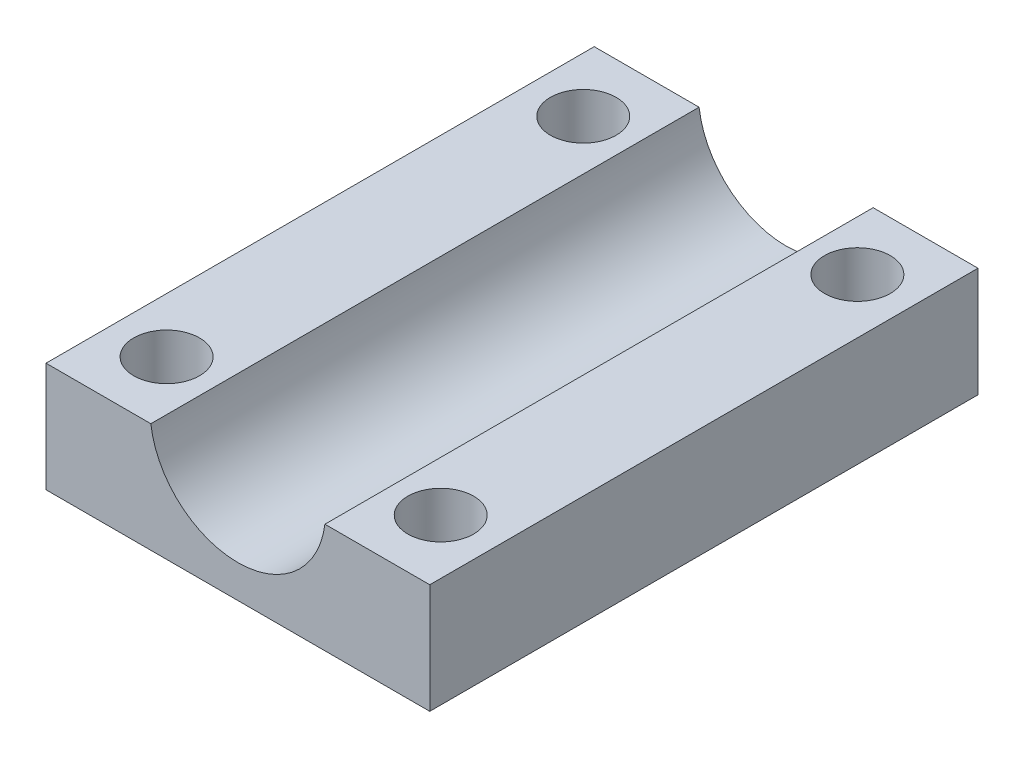
ISO-10303-21;
HEADER;
FILE_DESCRIPTION(('STEP AP214'),'2;1');
FILE_NAME('part.step','',(''),(''),'','','');
FILE_SCHEMA(('AUTOMOTIVE_DESIGN { 1 0 10303 214 1 1 1 1 }'));
ENDSEC;
DATA;
#1=APPLICATION_CONTEXT('core data for automotive mechanical design processes');
#2=APPLICATION_PROTOCOL_DEFINITION('international standard','automotive_design',2000,#1);
#3=PRODUCT_CONTEXT('',#1,'mechanical');
#4=PRODUCT('Part','Part','',(#3));
#5=PRODUCT_RELATED_PRODUCT_CATEGORY('part','',(#4));
#6=PRODUCT_DEFINITION_FORMATION('','',#4);
#7=PRODUCT_DEFINITION_CONTEXT('part definition',#1,'design');
#8=PRODUCT_DEFINITION('design','',#6,#7);
#9=PRODUCT_DEFINITION_SHAPE('','',#8);
#10=(LENGTH_UNIT() NAMED_UNIT(*) SI_UNIT(.MILLI.,.METRE.));
#11=(NAMED_UNIT(*) PLANE_ANGLE_UNIT() SI_UNIT($,.RADIAN.));
#12=(NAMED_UNIT(*) SI_UNIT($,.STERADIAN.) SOLID_ANGLE_UNIT());
#13=UNCERTAINTY_MEASURE_WITH_UNIT(LENGTH_MEASURE(1.E-05),#10,'distance_accuracy_value','');
#14=(GEOMETRIC_REPRESENTATION_CONTEXT(3) GLOBAL_UNCERTAINTY_ASSIGNED_CONTEXT((#13)) GLOBAL_UNIT_ASSIGNED_CONTEXT((#10,
#11,#12)) REPRESENTATION_CONTEXT('',''));
#15=CARTESIAN_POINT('',(0.,0.,0.));
#16=DIRECTION('',(0.,0.,1.));
#17=DIRECTION('',(1.,0.,0.));
#18=AXIS2_PLACEMENT_3D('',#15,#16,#17);
#19=CARTESIAN_POINT('',(-17.5,-11.9285808591117,-50.));
#20=DIRECTION('',(-1.,0.,0.));
#21=DIRECTION('',(0.,0.,1.));
#22=AXIS2_PLACEMENT_3D('',#19,#20,#21);
#23=PLANE('',#22);
#24=DIRECTION('',(0.,-1.,0.));
#25=VECTOR('',#24,1.);
#26=CARTESIAN_POINT('',(-17.5,-11.9285808591117,0.));
#27=LINE('',#26,#25);
#28=CARTESIAN_POINT('',(-17.5,-11.9285808591117,0.));
#29=VERTEX_POINT('',#28);
#30=CARTESIAN_POINT('',(-17.5,-21.9285808591117,0.));
#31=VERTEX_POINT('',#30);
#32=EDGE_CURVE('E132',#29,#31,#27,.T.);
#33=ORIENTED_EDGE('',*,*,#32,.F.);
#34=DIRECTION('',(0.,0.,1.));
#35=VECTOR('',#34,1.);
#36=CARTESIAN_POINT('',(-17.5,-11.9285808591117,-50.));
#37=LINE('',#36,#35);
#38=CARTESIAN_POINT('',(-17.5,-11.9285808591117,-50.));
#39=VERTEX_POINT('',#38);
#40=EDGE_CURVE('E13',#39,#29,#37,.T.);
#41=ORIENTED_EDGE('',*,*,#40,.F.);
#42=DIRECTION('',(0.,-1.,0.));
#43=VECTOR('',#42,1.);
#44=CARTESIAN_POINT('',(-17.5,-11.9285808591117,-50.));
#45=LINE('',#44,#43);
#46=CARTESIAN_POINT('',(-17.5,-21.9285808591117,-50.));
#47=VERTEX_POINT('',#46);
#48=EDGE_CURVE('E147',#39,#47,#45,.T.);
#49=ORIENTED_EDGE('',*,*,#48,.T.);
#50=DIRECTION('',(0.,0.,1.));
#51=VECTOR('',#50,1.);
#52=CARTESIAN_POINT('',(-17.5,-21.9285808591117,-50.));
#53=LINE('',#52,#51);
#54=EDGE_CURVE('E50',#47,#31,#53,.T.);
#55=ORIENTED_EDGE('',*,*,#54,.T.);
#56=EDGE_LOOP('',(#33,#41,#49,#55));
#57=FACE_BOUND('',#56,.T.);
#58=ADVANCED_FACE('F47',(#57),#23,.T.);
#59=CARTESIAN_POINT('',(-17.5,-11.9285808591117,-50.));
#60=DIRECTION('',(0.,1.,0.));
#61=DIRECTION('',(0.,0.,1.));
#62=AXIS2_PLACEMENT_3D('',#59,#60,#61);
#63=PLANE('',#62);
#64=CARTESIAN_POINT('',(-12.5,-11.9285808591117,-6.));
#65=DIRECTION('',(0.,-1.,0.));
#66=DIRECTION('',(0.,0.,1.));
#67=AXIS2_PLACEMENT_3D('',#64,#65,#66);
#68=CIRCLE('',#67,3.);
#69=CARTESIAN_POINT('',(-12.5,-11.9285808591117,-3.));
#70=VERTEX_POINT('',#69);
#71=EDGE_CURVE('E196',#70,#70,#68,.T.);
#72=ORIENTED_EDGE('',*,*,#71,.T.);
#73=EDGE_LOOP('',(#72));
#74=FACE_BOUND('',#73,.T.);
#75=CARTESIAN_POINT('',(-12.5,-11.9285808591117,-44.));
#76=DIRECTION('',(0.,-1.,0.));
#77=DIRECTION('',(0.,0.,-1.));
#78=AXIS2_PLACEMENT_3D('',#75,#76,#77);
#79=CIRCLE('',#78,3.);
#80=CARTESIAN_POINT('',(-12.5,-11.9285808591117,-47.));
#81=VERTEX_POINT('',#80);
#82=EDGE_CURVE('E208',#81,#81,#79,.T.);
#83=ORIENTED_EDGE('',*,*,#82,.T.);
#84=EDGE_LOOP('',(#83));
#85=FACE_BOUND('',#84,.T.);
#86=DIRECTION('',(-1.,0.,0.));
#87=VECTOR('',#86,1.);
#88=CARTESIAN_POINT('',(-17.5,-11.9285808591117,0.));
#89=LINE('',#88,#87);
#90=CARTESIAN_POINT('',(-7.93725393319377,-11.9285808591117,0.));
#91=VERTEX_POINT('',#90);
#92=EDGE_CURVE('E145',#91,#29,#89,.T.);
#93=ORIENTED_EDGE('',*,*,#92,.F.);
#94=DIRECTION('',(0.,0.,1.));
#95=VECTOR('',#94,1.);
#96=CARTESIAN_POINT('',(-7.93725393319377,-11.9285808591117,-50.));
#97=LINE('',#96,#95);
#98=CARTESIAN_POINT('',(-7.93725393319377,-11.9285808591117,-50.));
#99=VERTEX_POINT('',#98);
#100=EDGE_CURVE('E56',#99,#91,#97,.T.);
#101=ORIENTED_EDGE('',*,*,#100,.F.);
#102=DIRECTION('',(-1.,0.,0.));
#103=VECTOR('',#102,1.);
#104=CARTESIAN_POINT('',(-17.5,-11.9285808591117,-50.));
#105=LINE('',#104,#103);
#106=EDGE_CURVE('E122',#99,#39,#105,.T.);
#107=ORIENTED_EDGE('',*,*,#106,.T.);
#108=ORIENTED_EDGE('',*,*,#40,.T.);
#109=EDGE_LOOP('',(#93,#101,#107,#108));
#110=FACE_BOUND('',#109,.T.);
#111=ADVANCED_FACE('F155',(#74,#85,#110),#63,.T.);
#112=CARTESIAN_POINT('',(0.,-10.9285808591117,-50.));
#113=DIRECTION('',(0.,0.,1.));
#114=DIRECTION('',(1.,0.,0.));
#115=AXIS2_PLACEMENT_3D('',#112,#113,#114);
#116=CYLINDRICAL_SURFACE('',#115,8.);
#117=CARTESIAN_POINT('',(0.,-10.9285808591117,0.));
#118=DIRECTION('',(0.,0.,-1.));
#119=DIRECTION('',(1.,0.,0.));
#120=AXIS2_PLACEMENT_3D('',#117,#118,#119);
#121=CIRCLE('',#120,8.);
#122=CARTESIAN_POINT('',(7.93725393319377,-11.9285808591117,0.));
#123=VERTEX_POINT('',#122);
#124=EDGE_CURVE('E109',#123,#91,#121,.T.);
#125=ORIENTED_EDGE('',*,*,#124,.F.);
#126=DIRECTION('',(0.,0.,1.));
#127=VECTOR('',#126,1.);
#128=CARTESIAN_POINT('',(7.93725393319377,-11.9285808591117,-50.));
#129=LINE('',#128,#127);
#130=CARTESIAN_POINT('',(7.93725393319377,-11.9285808591117,-50.));
#131=VERTEX_POINT('',#130);
#132=EDGE_CURVE('E104',#131,#123,#129,.T.);
#133=ORIENTED_EDGE('',*,*,#132,.F.);
#134=CARTESIAN_POINT('',(0.,-10.9285808591117,-50.));
#135=DIRECTION('',(0.,0.,-1.));
#136=DIRECTION('',(1.,0.,0.));
#137=AXIS2_PLACEMENT_3D('',#134,#135,#136);
#138=CIRCLE('',#137,8.);
#139=EDGE_CURVE('E107',#131,#99,#138,.T.);
#140=ORIENTED_EDGE('',*,*,#139,.T.);
#141=ORIENTED_EDGE('',*,*,#100,.T.);
#142=EDGE_LOOP('',(#125,#133,#140,#141));
#143=FACE_BOUND('',#142,.T.);
#144=ADVANCED_FACE('F106',(#143),#116,.F.);
#145=CARTESIAN_POINT('',(7.93725393319377,-11.9285808591117,-50.));
#146=DIRECTION('',(0.,1.,0.));
#147=DIRECTION('',(0.,0.,1.));
#148=AXIS2_PLACEMENT_3D('',#145,#146,#147);
#149=PLANE('',#148);
#150=CARTESIAN_POINT('',(12.5,-11.9285808591117,-44.));
#151=DIRECTION('',(0.,-1.,0.));
#152=DIRECTION('',(0.,0.,1.));
#153=AXIS2_PLACEMENT_3D('',#150,#151,#152);
#154=CIRCLE('',#153,3.);
#155=CARTESIAN_POINT('',(12.5,-11.9285808591117,-41.));
#156=VERTEX_POINT('',#155);
#157=EDGE_CURVE('E204',#156,#156,#154,.T.);
#158=ORIENTED_EDGE('',*,*,#157,.T.);
#159=EDGE_LOOP('',(#158));
#160=FACE_BOUND('',#159,.T.);
#161=CARTESIAN_POINT('',(12.5,-11.9285808591117,-6.));
#162=DIRECTION('',(0.,-1.,0.));
#163=DIRECTION('',(0.,0.,-1.));
#164=AXIS2_PLACEMENT_3D('',#161,#162,#163);
#165=CIRCLE('',#164,3.);
#166=CARTESIAN_POINT('',(12.5,-11.9285808591117,-9.));
#167=VERTEX_POINT('',#166);
#168=EDGE_CURVE('E136',#167,#167,#165,.T.);
#169=ORIENTED_EDGE('',*,*,#168,.T.);
#170=EDGE_LOOP('',(#169));
#171=FACE_BOUND('',#170,.T.);
#172=DIRECTION('',(-1.,0.,0.));
#173=VECTOR('',#172,1.);
#174=CARTESIAN_POINT('',(7.93725393319377,-11.9285808591117,0.));
#175=LINE('',#174,#173);
#176=CARTESIAN_POINT('',(17.5,-11.9285808591117,0.));
#177=VERTEX_POINT('',#176);
#178=EDGE_CURVE('E142',#177,#123,#175,.T.);
#179=ORIENTED_EDGE('',*,*,#178,.F.);
#180=DIRECTION('',(0.,0.,1.));
#181=VECTOR('',#180,1.);
#182=CARTESIAN_POINT('',(17.5,-11.9285808591117,-50.));
#183=LINE('',#182,#181);
#184=CARTESIAN_POINT('',(17.5,-11.9285808591117,-50.));
#185=VERTEX_POINT('',#184);
#186=EDGE_CURVE('E114',#185,#177,#183,.T.);
#187=ORIENTED_EDGE('',*,*,#186,.F.);
#188=DIRECTION('',(-1.,0.,0.));
#189=VECTOR('',#188,1.);
#190=CARTESIAN_POINT('',(7.93725393319377,-11.9285808591117,-50.));
#191=LINE('',#190,#189);
#192=EDGE_CURVE('E120',#185,#131,#191,.T.);
#193=ORIENTED_EDGE('',*,*,#192,.T.);
#194=ORIENTED_EDGE('',*,*,#132,.T.);
#195=EDGE_LOOP('',(#179,#187,#193,#194));
#196=FACE_BOUND('',#195,.T.);
#197=ADVANCED_FACE('F124',(#160,#171,#196),#149,.T.);
#198=CARTESIAN_POINT('',(17.5,-11.9285808591117,-50.));
#199=DIRECTION('',(1.,0.,0.));
#200=DIRECTION('',(0.,1.,0.));
#201=AXIS2_PLACEMENT_3D('',#198,#199,#200);
#202=PLANE('',#201);
#203=DIRECTION('',(0.,1.,0.));
#204=VECTOR('',#203,1.);
#205=CARTESIAN_POINT('',(17.5,-11.9285808591117,0.));
#206=LINE('',#205,#204);
#207=CARTESIAN_POINT('',(17.5,-21.9285808591117,0.));
#208=VERTEX_POINT('',#207);
#209=EDGE_CURVE('E139',#208,#177,#206,.T.);
#210=ORIENTED_EDGE('',*,*,#209,.F.);
#211=DIRECTION('',(0.,0.,1.));
#212=VECTOR('',#211,1.);
#213=CARTESIAN_POINT('',(17.5,-21.9285808591117,-50.));
#214=LINE('',#213,#212);
#215=CARTESIAN_POINT('',(17.5,-21.9285808591117,-50.));
#216=VERTEX_POINT('',#215);
#217=EDGE_CURVE('E150',#216,#208,#214,.T.);
#218=ORIENTED_EDGE('',*,*,#217,.F.);
#219=DIRECTION('',(0.,1.,0.));
#220=VECTOR('',#219,1.);
#221=CARTESIAN_POINT('',(17.5,-11.9285808591117,-50.));
#222=LINE('',#221,#220);
#223=EDGE_CURVE('E125',#216,#185,#222,.T.);
#224=ORIENTED_EDGE('',*,*,#223,.T.);
#225=ORIENTED_EDGE('',*,*,#186,.T.);
#226=EDGE_LOOP('',(#210,#218,#224,#225));
#227=FACE_BOUND('',#226,.T.);
#228=ADVANCED_FACE('F171',(#227),#202,.T.);
#229=CARTESIAN_POINT('',(-17.5,-21.9285808591117,-50.));
#230=DIRECTION('',(0.,-1.,0.));
#231=DIRECTION('',(1.,0.,0.));
#232=AXIS2_PLACEMENT_3D('',#229,#230,#231);
#233=PLANE('',#232);
#234=CARTESIAN_POINT('',(-12.5,-21.9285808591117,-6.));
#235=DIRECTION('',(0.,-1.,0.));
#236=DIRECTION('',(0.,0.,1.));
#237=AXIS2_PLACEMENT_3D('',#234,#235,#236);
#238=CIRCLE('',#237,3.);
#239=CARTESIAN_POINT('',(-12.5,-21.9285808591117,-3.));
#240=VERTEX_POINT('',#239);
#241=EDGE_CURVE('E183',#240,#240,#238,.T.);
#242=ORIENTED_EDGE('',*,*,#241,.F.);
#243=EDGE_LOOP('',(#242));
#244=FACE_BOUND('',#243,.T.);
#245=CARTESIAN_POINT('',(-12.5,-21.9285808591117,-44.));
#246=DIRECTION('',(0.,-1.,0.));
#247=DIRECTION('',(0.,0.,-1.));
#248=AXIS2_PLACEMENT_3D('',#245,#246,#247);
#249=CIRCLE('',#248,3.);
#250=CARTESIAN_POINT('',(-12.5,-21.9285808591117,-47.));
#251=VERTEX_POINT('',#250);
#252=EDGE_CURVE('E187',#251,#251,#249,.T.);
#253=ORIENTED_EDGE('',*,*,#252,.F.);
#254=EDGE_LOOP('',(#253));
#255=FACE_BOUND('',#254,.T.);
#256=CARTESIAN_POINT('',(12.5,-21.9285808591117,-44.));
#257=DIRECTION('',(0.,-1.,0.));
#258=DIRECTION('',(0.,0.,1.));
#259=AXIS2_PLACEMENT_3D('',#256,#257,#258);
#260=CIRCLE('',#259,3.);
#261=CARTESIAN_POINT('',(12.5,-21.9285808591117,-41.));
#262=VERTEX_POINT('',#261);
#263=EDGE_CURVE('E191',#262,#262,#260,.T.);
#264=ORIENTED_EDGE('',*,*,#263,.F.);
#265=EDGE_LOOP('',(#264));
#266=FACE_BOUND('',#265,.T.);
#267=CARTESIAN_POINT('',(12.5,-21.9285808591117,-6.));
#268=DIRECTION('',(0.,-1.,0.));
#269=DIRECTION('',(0.,0.,-1.));
#270=AXIS2_PLACEMENT_3D('',#267,#268,#269);
#271=CIRCLE('',#270,3.);
#272=CARTESIAN_POINT('',(12.5,-21.9285808591117,-9.));
#273=VERTEX_POINT('',#272);
#274=EDGE_CURVE('E194',#273,#273,#271,.T.);
#275=ORIENTED_EDGE('',*,*,#274,.F.);
#276=EDGE_LOOP('',(#275));
#277=FACE_BOUND('',#276,.T.);
#278=DIRECTION('',(1.,0.,0.));
#279=VECTOR('',#278,1.);
#280=CARTESIAN_POINT('',(-17.5,-21.9285808591117,0.));
#281=LINE('',#280,#279);
#282=EDGE_CURVE('E135',#31,#208,#281,.T.);
#283=ORIENTED_EDGE('',*,*,#282,.F.);
#284=ORIENTED_EDGE('',*,*,#54,.F.);
#285=DIRECTION('',(1.,0.,0.));
#286=VECTOR('',#285,1.);
#287=CARTESIAN_POINT('',(-17.5,-21.9285808591117,-50.));
#288=LINE('',#287,#286);
#289=EDGE_CURVE('E127',#47,#216,#288,.T.);
#290=ORIENTED_EDGE('',*,*,#289,.T.);
#291=ORIENTED_EDGE('',*,*,#217,.T.);
#292=EDGE_LOOP('',(#283,#284,#290,#291));
#293=FACE_BOUND('',#292,.T.);
#294=ADVANCED_FACE('F152',(#244,#255,#266,#277,#293),#233,.T.);
#295=CARTESIAN_POINT('',(0.,-10.9285808591117,-50.));
#296=DIRECTION('',(0.,0.,1.));
#297=DIRECTION('',(1.,0.,0.));
#298=AXIS2_PLACEMENT_3D('',#295,#296,#297);
#299=PLANE('',#298);
#300=ORIENTED_EDGE('',*,*,#48,.F.);
#301=ORIENTED_EDGE('',*,*,#106,.F.);
#302=ORIENTED_EDGE('',*,*,#139,.F.);
#303=ORIENTED_EDGE('',*,*,#192,.F.);
#304=ORIENTED_EDGE('',*,*,#223,.F.);
#305=ORIENTED_EDGE('',*,*,#289,.F.);
#306=EDGE_LOOP('',(#300,#301,#302,#303,#304,#305));
#307=FACE_BOUND('',#306,.T.);
#308=ADVANCED_FACE('F118',(#307),#299,.F.);
#309=CARTESIAN_POINT('',(0.,-10.9285808591117,0.));
#310=DIRECTION('',(0.,0.,1.));
#311=DIRECTION('',(1.,0.,0.));
#312=AXIS2_PLACEMENT_3D('',#309,#310,#311);
#313=PLANE('',#312);
#314=ORIENTED_EDGE('',*,*,#32,.T.);
#315=ORIENTED_EDGE('',*,*,#282,.T.);
#316=ORIENTED_EDGE('',*,*,#209,.T.);
#317=ORIENTED_EDGE('',*,*,#178,.T.);
#318=ORIENTED_EDGE('',*,*,#124,.T.);
#319=ORIENTED_EDGE('',*,*,#92,.T.);
#320=EDGE_LOOP('',(#314,#315,#316,#317,#318,#319));
#321=FACE_BOUND('',#320,.T.);
#322=ADVANCED_FACE('F154',(#321),#313,.T.);
#323=CARTESIAN_POINT('',(12.5,-11.9285808591117,-6.));
#324=DIRECTION('',(0.,-1.,0.));
#325=DIRECTION('',(0.,0.,-1.));
#326=AXIS2_PLACEMENT_3D('',#323,#324,#325);
#327=CYLINDRICAL_SURFACE('',#326,3.);
#328=ORIENTED_EDGE('',*,*,#168,.F.);
#329=EDGE_LOOP('',(#328));
#330=FACE_BOUND('',#329,.T.);
#331=ORIENTED_EDGE('',*,*,#274,.T.);
#332=EDGE_LOOP('',(#331));
#333=FACE_BOUND('',#332,.T.);
#334=ADVANCED_FACE('F227',(#330,#333),#327,.F.);
#335=CARTESIAN_POINT('',(12.5,-11.9285808591117,-44.));
#336=DIRECTION('',(0.,-1.,0.));
#337=DIRECTION('',(0.,0.,-1.));
#338=AXIS2_PLACEMENT_3D('',#335,#336,#337);
#339=CYLINDRICAL_SURFACE('',#338,3.);
#340=ORIENTED_EDGE('',*,*,#157,.F.);
#341=EDGE_LOOP('',(#340));
#342=FACE_BOUND('',#341,.T.);
#343=ORIENTED_EDGE('',*,*,#263,.T.);
#344=EDGE_LOOP('',(#343));
#345=FACE_BOUND('',#344,.T.);
#346=ADVANCED_FACE('F220',(#342,#345),#339,.F.);
#347=CARTESIAN_POINT('',(-12.5,-11.9285808591117,-44.));
#348=DIRECTION('',(0.,-1.,0.));
#349=DIRECTION('',(0.,0.,-1.));
#350=AXIS2_PLACEMENT_3D('',#347,#348,#349);
#351=CYLINDRICAL_SURFACE('',#350,3.);
#352=ORIENTED_EDGE('',*,*,#82,.F.);
#353=EDGE_LOOP('',(#352));
#354=FACE_BOUND('',#353,.T.);
#355=ORIENTED_EDGE('',*,*,#252,.T.);
#356=EDGE_LOOP('',(#355));
#357=FACE_BOUND('',#356,.T.);
#358=ADVANCED_FACE('F214',(#354,#357),#351,.F.);
#359=CARTESIAN_POINT('',(-12.5,-11.9285808591117,-6.));
#360=DIRECTION('',(0.,-1.,0.));
#361=DIRECTION('',(0.,0.,-1.));
#362=AXIS2_PLACEMENT_3D('',#359,#360,#361);
#363=CYLINDRICAL_SURFACE('',#362,3.);
#364=ORIENTED_EDGE('',*,*,#71,.F.);
#365=EDGE_LOOP('',(#364));
#366=FACE_BOUND('',#365,.T.);
#367=ORIENTED_EDGE('',*,*,#241,.T.);
#368=EDGE_LOOP('',(#367));
#369=FACE_BOUND('',#368,.T.);
#370=ADVANCED_FACE('F212',(#366,#369),#363,.F.);
#371=CLOSED_SHELL('',(#58,#111,#144,#197,#228,#294,#308,#322,#334,#346,#358,#370));
#372=MANIFOLD_SOLID_BREP('B2',#371);
#373=ADVANCED_BREP_SHAPE_REPRESENTATION('',(#18,#372),#14);
#374=SHAPE_DEFINITION_REPRESENTATION(#9,#373);
ENDSEC;
END-ISO-10303-21;
